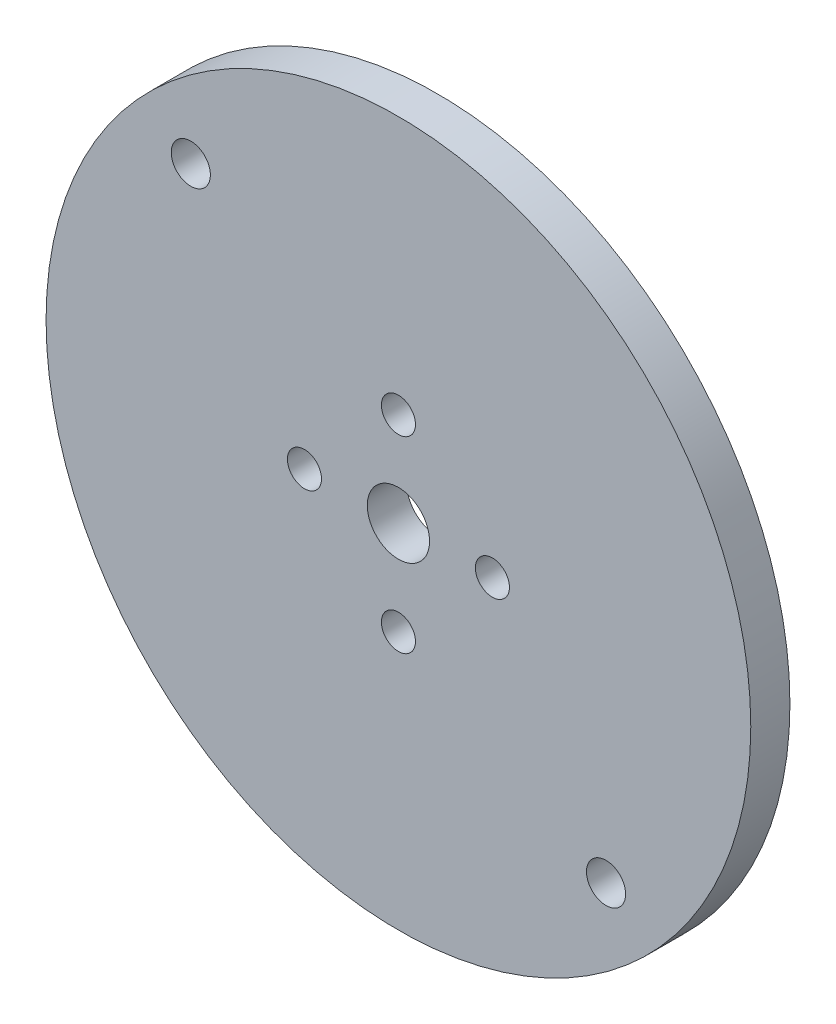
ISO-10303-21;
HEADER;
FILE_DESCRIPTION(('STEP AP214'),'2;1');
FILE_NAME('part.step','',(''),(''),'','','');
FILE_SCHEMA(('AUTOMOTIVE_DESIGN { 1 0 10303 214 1 1 1 1 }'));
ENDSEC;
DATA;
#1=APPLICATION_CONTEXT('core data for automotive mechanical design processes');
#2=APPLICATION_PROTOCOL_DEFINITION('international standard','automotive_design',2000,#1);
#3=PRODUCT_CONTEXT('',#1,'mechanical');
#4=PRODUCT('Part','Part','',(#3));
#5=PRODUCT_RELATED_PRODUCT_CATEGORY('part','',(#4));
#6=PRODUCT_DEFINITION_FORMATION('','',#4);
#7=PRODUCT_DEFINITION_CONTEXT('part definition',#1,'design');
#8=PRODUCT_DEFINITION('design','',#6,#7);
#9=PRODUCT_DEFINITION_SHAPE('','',#8);
#10=(LENGTH_UNIT() NAMED_UNIT(*) SI_UNIT(.MILLI.,.METRE.));
#11=(NAMED_UNIT(*) PLANE_ANGLE_UNIT() SI_UNIT($,.RADIAN.));
#12=(NAMED_UNIT(*) SI_UNIT($,.STERADIAN.) SOLID_ANGLE_UNIT());
#13=UNCERTAINTY_MEASURE_WITH_UNIT(LENGTH_MEASURE(1.E-05),#10,'distance_accuracy_value','');
#14=(GEOMETRIC_REPRESENTATION_CONTEXT(3) GLOBAL_UNCERTAINTY_ASSIGNED_CONTEXT((#13)) GLOBAL_UNIT_ASSIGNED_CONTEXT((#10,
#11,#12)) REPRESENTATION_CONTEXT('',''));
#15=CARTESIAN_POINT('',(0.,0.,0.));
#16=DIRECTION('',(0.,0.,1.));
#17=DIRECTION('',(1.,0.,0.));
#18=AXIS2_PLACEMENT_3D('',#15,#16,#17);
#19=CARTESIAN_POINT('',(0.,0.,5.));
#20=DIRECTION('',(0.,0.,1.));
#21=DIRECTION('',(1.,0.,0.));
#22=AXIS2_PLACEMENT_3D('',#19,#20,#21);
#23=PLANE('',#22);
#24=CARTESIAN_POINT('',(-26.5165042944953,26.5165042944956,5.));
#25=DIRECTION('',(0.,0.,1.));
#26=DIRECTION('',(1.,0.,0.));
#27=AXIS2_PLACEMENT_3D('',#24,#25,#26);
#28=CIRCLE('',#27,2.5);
#29=CARTESIAN_POINT('',(-24.0165042944953,26.5165042944956,5.));
#30=VERTEX_POINT('',#29);
#31=EDGE_CURVE('E71',#30,#30,#28,.T.);
#32=ORIENTED_EDGE('',*,*,#31,.F.);
#33=EDGE_LOOP('',(#32));
#34=FACE_BOUND('',#33,.T.);
#35=CARTESIAN_POINT('',(-12.,0.,5.));
#36=DIRECTION('',(0.,0.,1.));
#37=DIRECTION('',(1.,0.,0.));
#38=AXIS2_PLACEMENT_3D('',#35,#36,#37);
#39=CIRCLE('',#38,2.175);
#40=CARTESIAN_POINT('',(-9.825,0.,5.));
#41=VERTEX_POINT('',#40);
#42=EDGE_CURVE('E59',#41,#41,#39,.T.);
#43=ORIENTED_EDGE('',*,*,#42,.F.);
#44=EDGE_LOOP('',(#43));
#45=FACE_BOUND('',#44,.T.);
#46=CARTESIAN_POINT('',(12.,0.,5.));
#47=DIRECTION('',(0.,0.,1.));
#48=DIRECTION('',(1.,0.,0.));
#49=AXIS2_PLACEMENT_3D('',#46,#47,#48);
#50=CIRCLE('',#49,2.175);
#51=CARTESIAN_POINT('',(14.175,0.,5.));
#52=VERTEX_POINT('',#51);
#53=EDGE_CURVE('E47',#52,#52,#50,.T.);
#54=ORIENTED_EDGE('',*,*,#53,.F.);
#55=EDGE_LOOP('',(#54));
#56=FACE_BOUND('',#55,.T.);
#57=CARTESIAN_POINT('',(0.,0.,5.));
#58=DIRECTION('',(0.,0.,1.));
#59=DIRECTION('',(1.,0.,0.));
#60=AXIS2_PLACEMENT_3D('',#57,#58,#59);
#61=CIRCLE('',#60,45.);
#62=CARTESIAN_POINT('',(45.,0.,5.));
#63=VERTEX_POINT('',#62);
#64=EDGE_CURVE('E10',#63,#63,#61,.T.);
#65=ORIENTED_EDGE('',*,*,#64,.T.);
#66=EDGE_LOOP('',(#65));
#67=FACE_BOUND('',#66,.T.);
#68=CARTESIAN_POINT('',(0.,0.,5.));
#69=DIRECTION('',(0.,0.,1.));
#70=DIRECTION('',(1.,0.,0.));
#71=AXIS2_PLACEMENT_3D('',#68,#69,#70);
#72=CIRCLE('',#71,3.975);
#73=CARTESIAN_POINT('',(3.975,0.,5.));
#74=VERTEX_POINT('',#73);
#75=EDGE_CURVE('E42',#74,#74,#72,.T.);
#76=ORIENTED_EDGE('',*,*,#75,.F.);
#77=EDGE_LOOP('',(#76));
#78=FACE_BOUND('',#77,.T.);
#79=CARTESIAN_POINT('',(0.,12.,5.));
#80=DIRECTION('',(0.,0.,1.));
#81=DIRECTION('',(1.,0.,0.));
#82=AXIS2_PLACEMENT_3D('',#79,#80,#81);
#83=CIRCLE('',#82,2.175);
#84=CARTESIAN_POINT('',(2.175,12.,5.));
#85=VERTEX_POINT('',#84);
#86=EDGE_CURVE('E53',#85,#85,#83,.T.);
#87=ORIENTED_EDGE('',*,*,#86,.F.);
#88=EDGE_LOOP('',(#87));
#89=FACE_BOUND('',#88,.T.);
#90=CARTESIAN_POINT('',(0.,-12.,5.));
#91=DIRECTION('',(0.,0.,1.));
#92=DIRECTION('',(1.,0.,0.));
#93=AXIS2_PLACEMENT_3D('',#90,#91,#92);
#94=CIRCLE('',#93,2.175);
#95=CARTESIAN_POINT('',(2.175,-12.,5.));
#96=VERTEX_POINT('',#95);
#97=EDGE_CURVE('E65',#96,#96,#94,.T.);
#98=ORIENTED_EDGE('',*,*,#97,.F.);
#99=EDGE_LOOP('',(#98));
#100=FACE_BOUND('',#99,.T.);
#101=CARTESIAN_POINT('',(26.5165042944955,-26.5165042944958,5.));
#102=DIRECTION('',(0.,0.,1.));
#103=DIRECTION('',(1.,0.,0.));
#104=AXIS2_PLACEMENT_3D('',#101,#102,#103);
#105=CIRCLE('',#104,2.5);
#106=CARTESIAN_POINT('',(29.0165042944955,-26.5165042944958,5.));
#107=VERTEX_POINT('',#106);
#108=EDGE_CURVE('E77',#107,#107,#105,.T.);
#109=ORIENTED_EDGE('',*,*,#108,.F.);
#110=EDGE_LOOP('',(#109));
#111=FACE_BOUND('',#110,.T.);
#112=ADVANCED_FACE('F31',(#34,#45,#56,#67,#78,#89,#100,#111),#23,.T.);
#113=CARTESIAN_POINT('',(0.,0.,0.));
#114=DIRECTION('',(0.,0.,1.));
#115=DIRECTION('',(1.,0.,0.));
#116=AXIS2_PLACEMENT_3D('',#113,#114,#115);
#117=PLANE('',#116);
#118=CARTESIAN_POINT('',(0.,0.,0.));
#119=DIRECTION('',(0.,0.,1.));
#120=DIRECTION('',(1.,0.,0.));
#121=AXIS2_PLACEMENT_3D('',#118,#119,#120);
#122=CIRCLE('',#121,45.);
#123=CARTESIAN_POINT('',(45.,0.,0.));
#124=VERTEX_POINT('',#123);
#125=EDGE_CURVE('E35',#124,#124,#122,.T.);
#126=ORIENTED_EDGE('',*,*,#125,.F.);
#127=EDGE_LOOP('',(#126));
#128=FACE_BOUND('',#127,.T.);
#129=CARTESIAN_POINT('',(0.,0.,0.));
#130=DIRECTION('',(0.,0.,1.));
#131=DIRECTION('',(1.,0.,0.));
#132=AXIS2_PLACEMENT_3D('',#129,#130,#131);
#133=CIRCLE('',#132,3.975);
#134=CARTESIAN_POINT('',(3.975,0.,0.));
#135=VERTEX_POINT('',#134);
#136=EDGE_CURVE('E44',#135,#135,#133,.T.);
#137=ORIENTED_EDGE('',*,*,#136,.T.);
#138=EDGE_LOOP('',(#137));
#139=FACE_BOUND('',#138,.T.);
#140=CARTESIAN_POINT('',(12.,0.,0.));
#141=DIRECTION('',(0.,0.,1.));
#142=DIRECTION('',(1.,0.,0.));
#143=AXIS2_PLACEMENT_3D('',#140,#141,#142);
#144=CIRCLE('',#143,2.175);
#145=CARTESIAN_POINT('',(14.175,0.,0.));
#146=VERTEX_POINT('',#145);
#147=EDGE_CURVE('E50',#146,#146,#144,.T.);
#148=ORIENTED_EDGE('',*,*,#147,.T.);
#149=EDGE_LOOP('',(#148));
#150=FACE_BOUND('',#149,.T.);
#151=CARTESIAN_POINT('',(0.,12.,0.));
#152=DIRECTION('',(0.,0.,1.));
#153=DIRECTION('',(1.,0.,0.));
#154=AXIS2_PLACEMENT_3D('',#151,#152,#153);
#155=CIRCLE('',#154,2.175);
#156=CARTESIAN_POINT('',(2.175,12.,0.));
#157=VERTEX_POINT('',#156);
#158=EDGE_CURVE('E56',#157,#157,#155,.T.);
#159=ORIENTED_EDGE('',*,*,#158,.T.);
#160=EDGE_LOOP('',(#159));
#161=FACE_BOUND('',#160,.T.);
#162=CARTESIAN_POINT('',(-12.,0.,0.));
#163=DIRECTION('',(0.,0.,1.));
#164=DIRECTION('',(1.,0.,0.));
#165=AXIS2_PLACEMENT_3D('',#162,#163,#164);
#166=CIRCLE('',#165,2.175);
#167=CARTESIAN_POINT('',(-9.825,0.,0.));
#168=VERTEX_POINT('',#167);
#169=EDGE_CURVE('E62',#168,#168,#166,.T.);
#170=ORIENTED_EDGE('',*,*,#169,.T.);
#171=EDGE_LOOP('',(#170));
#172=FACE_BOUND('',#171,.T.);
#173=CARTESIAN_POINT('',(0.,-12.,0.));
#174=DIRECTION('',(0.,0.,1.));
#175=DIRECTION('',(1.,0.,0.));
#176=AXIS2_PLACEMENT_3D('',#173,#174,#175);
#177=CIRCLE('',#176,2.175);
#178=CARTESIAN_POINT('',(2.175,-12.,0.));
#179=VERTEX_POINT('',#178);
#180=EDGE_CURVE('E68',#179,#179,#177,.T.);
#181=ORIENTED_EDGE('',*,*,#180,.T.);
#182=EDGE_LOOP('',(#181));
#183=FACE_BOUND('',#182,.T.);
#184=CARTESIAN_POINT('',(-26.5165042944953,26.5165042944956,0.));
#185=DIRECTION('',(0.,0.,1.));
#186=DIRECTION('',(1.,0.,0.));
#187=AXIS2_PLACEMENT_3D('',#184,#185,#186);
#188=CIRCLE('',#187,2.5);
#189=CARTESIAN_POINT('',(-24.0165042944953,26.5165042944956,0.));
#190=VERTEX_POINT('',#189);
#191=EDGE_CURVE('E74',#190,#190,#188,.T.);
#192=ORIENTED_EDGE('',*,*,#191,.T.);
#193=EDGE_LOOP('',(#192));
#194=FACE_BOUND('',#193,.T.);
#195=CARTESIAN_POINT('',(26.5165042944955,-26.5165042944958,0.));
#196=DIRECTION('',(0.,0.,1.));
#197=DIRECTION('',(1.,0.,0.));
#198=AXIS2_PLACEMENT_3D('',#195,#196,#197);
#199=CIRCLE('',#198,2.5);
#200=CARTESIAN_POINT('',(29.0165042944955,-26.5165042944958,0.));
#201=VERTEX_POINT('',#200);
#202=EDGE_CURVE('E80',#201,#201,#199,.T.);
#203=ORIENTED_EDGE('',*,*,#202,.T.);
#204=EDGE_LOOP('',(#203));
#205=FACE_BOUND('',#204,.T.);
#206=ADVANCED_FACE('F90',(#128,#139,#150,#161,#172,#183,#194,#205),#117,.F.);
#207=CARTESIAN_POINT('',(0.,0.,5.));
#208=DIRECTION('',(0.,0.,-1.));
#209=DIRECTION('',(-1.,0.,0.));
#210=AXIS2_PLACEMENT_3D('',#207,#208,#209);
#211=CYLINDRICAL_SURFACE('',#210,45.);
#212=ORIENTED_EDGE('',*,*,#64,.F.);
#213=EDGE_LOOP('',(#212));
#214=FACE_BOUND('',#213,.T.);
#215=ORIENTED_EDGE('',*,*,#125,.T.);
#216=EDGE_LOOP('',(#215));
#217=FACE_BOUND('',#216,.T.);
#218=ADVANCED_FACE('F33',(#214,#217),#211,.T.);
#219=CARTESIAN_POINT('',(0.,0.,5.));
#220=DIRECTION('',(0.,0.,-1.));
#221=DIRECTION('',(-1.,0.,0.));
#222=AXIS2_PLACEMENT_3D('',#219,#220,#221);
#223=CYLINDRICAL_SURFACE('',#222,3.975);
#224=ORIENTED_EDGE('',*,*,#75,.T.);
#225=EDGE_LOOP('',(#224));
#226=FACE_BOUND('',#225,.T.);
#227=ORIENTED_EDGE('',*,*,#136,.F.);
#228=EDGE_LOOP('',(#227));
#229=FACE_BOUND('',#228,.T.);
#230=ADVANCED_FACE('F100',(#226,#229),#223,.F.);
#231=CARTESIAN_POINT('',(12.,0.,5.));
#232=DIRECTION('',(0.,0.,-1.));
#233=DIRECTION('',(-1.,0.,0.));
#234=AXIS2_PLACEMENT_3D('',#231,#232,#233);
#235=CYLINDRICAL_SURFACE('',#234,2.175);
#236=ORIENTED_EDGE('',*,*,#53,.T.);
#237=EDGE_LOOP('',(#236));
#238=FACE_BOUND('',#237,.T.);
#239=ORIENTED_EDGE('',*,*,#147,.F.);
#240=EDGE_LOOP('',(#239));
#241=FACE_BOUND('',#240,.T.);
#242=ADVANCED_FACE('F103',(#238,#241),#235,.F.);
#243=CARTESIAN_POINT('',(0.,12.,5.));
#244=DIRECTION('',(0.,0.,-1.));
#245=DIRECTION('',(-1.,0.,0.));
#246=AXIS2_PLACEMENT_3D('',#243,#244,#245);
#247=CYLINDRICAL_SURFACE('',#246,2.175);
#248=ORIENTED_EDGE('',*,*,#86,.T.);
#249=EDGE_LOOP('',(#248));
#250=FACE_BOUND('',#249,.T.);
#251=ORIENTED_EDGE('',*,*,#158,.F.);
#252=EDGE_LOOP('',(#251));
#253=FACE_BOUND('',#252,.T.);
#254=ADVANCED_FACE('F107',(#250,#253),#247,.F.);
#255=CARTESIAN_POINT('',(-12.,0.,5.));
#256=DIRECTION('',(0.,0.,-1.));
#257=DIRECTION('',(-1.,0.,0.));
#258=AXIS2_PLACEMENT_3D('',#255,#256,#257);
#259=CYLINDRICAL_SURFACE('',#258,2.175);
#260=ORIENTED_EDGE('',*,*,#42,.T.);
#261=EDGE_LOOP('',(#260));
#262=FACE_BOUND('',#261,.T.);
#263=ORIENTED_EDGE('',*,*,#169,.F.);
#264=EDGE_LOOP('',(#263));
#265=FACE_BOUND('',#264,.T.);
#266=ADVANCED_FACE('F111',(#262,#265),#259,.F.);
#267=CARTESIAN_POINT('',(0.,-12.,5.));
#268=DIRECTION('',(0.,0.,-1.));
#269=DIRECTION('',(-1.,0.,0.));
#270=AXIS2_PLACEMENT_3D('',#267,#268,#269);
#271=CYLINDRICAL_SURFACE('',#270,2.175);
#272=ORIENTED_EDGE('',*,*,#97,.T.);
#273=EDGE_LOOP('',(#272));
#274=FACE_BOUND('',#273,.T.);
#275=ORIENTED_EDGE('',*,*,#180,.F.);
#276=EDGE_LOOP('',(#275));
#277=FACE_BOUND('',#276,.T.);
#278=ADVANCED_FACE('F115',(#274,#277),#271,.F.);
#279=CARTESIAN_POINT('',(-26.5165042944953,26.5165042944956,5.));
#280=DIRECTION('',(0.,0.,-1.));
#281=DIRECTION('',(-1.,0.,0.));
#282=AXIS2_PLACEMENT_3D('',#279,#280,#281);
#283=CYLINDRICAL_SURFACE('',#282,2.5);
#284=ORIENTED_EDGE('',*,*,#31,.T.);
#285=EDGE_LOOP('',(#284));
#286=FACE_BOUND('',#285,.T.);
#287=ORIENTED_EDGE('',*,*,#191,.F.);
#288=EDGE_LOOP('',(#287));
#289=FACE_BOUND('',#288,.T.);
#290=ADVANCED_FACE('F119',(#286,#289),#283,.F.);
#291=CARTESIAN_POINT('',(26.5165042944955,-26.5165042944958,5.));
#292=DIRECTION('',(0.,0.,-1.));
#293=DIRECTION('',(-1.,0.,0.));
#294=AXIS2_PLACEMENT_3D('',#291,#292,#293);
#295=CYLINDRICAL_SURFACE('',#294,2.5);
#296=ORIENTED_EDGE('',*,*,#108,.T.);
#297=EDGE_LOOP('',(#296));
#298=FACE_BOUND('',#297,.T.);
#299=ORIENTED_EDGE('',*,*,#202,.F.);
#300=EDGE_LOOP('',(#299));
#301=FACE_BOUND('',#300,.T.);
#302=ADVANCED_FACE('F86',(#298,#301),#295,.F.);
#303=CLOSED_SHELL('',(#112,#206,#218,#230,#242,#254,#266,#278,#290,#302));
#304=MANIFOLD_SOLID_BREP('B2',#303);
#305=ADVANCED_BREP_SHAPE_REPRESENTATION('',(#18,#304),#14);
#306=SHAPE_DEFINITION_REPRESENTATION(#9,#305);
ENDSEC;
END-ISO-10303-21;
